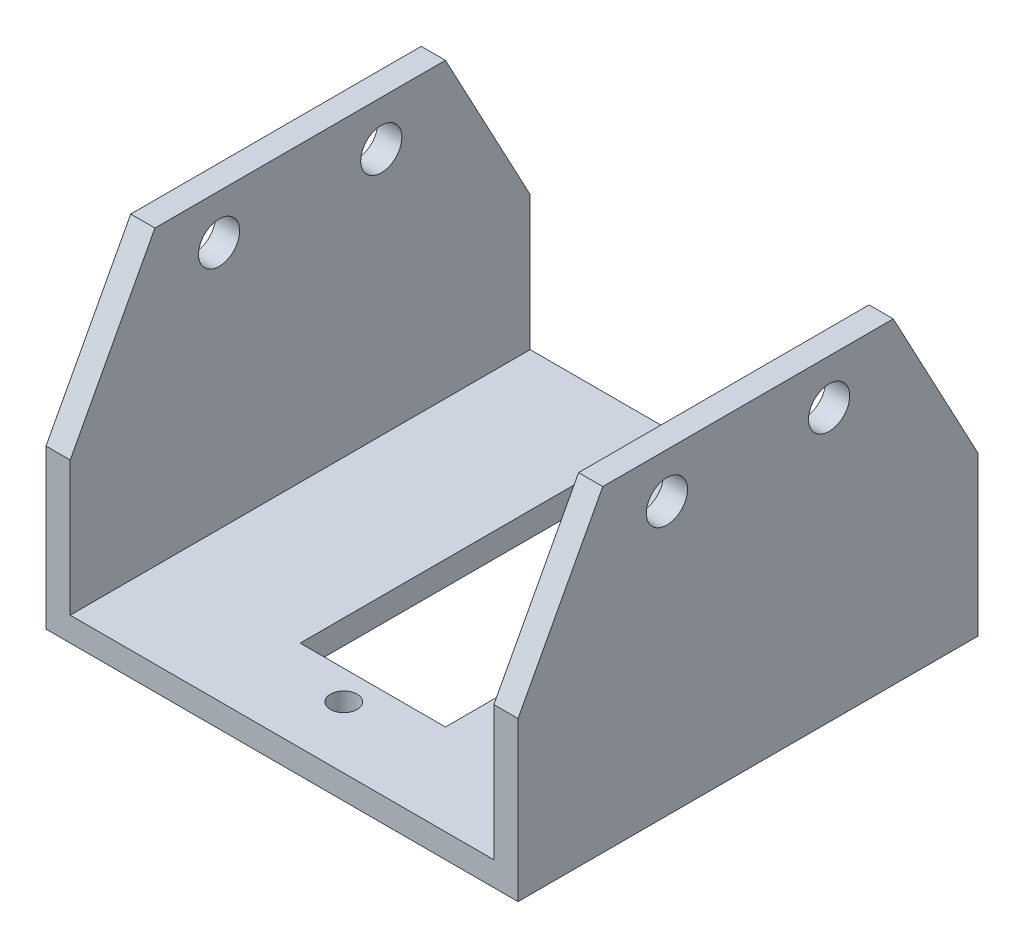
ISO-10303-21;
HEADER;
FILE_DESCRIPTION(('STEP AP214'),'2;1');
FILE_NAME('part.step','',(''),(''),'','','');
FILE_SCHEMA(('AUTOMOTIVE_DESIGN { 1 0 10303 214 1 1 1 1 }'));
ENDSEC;
DATA;
#1=APPLICATION_CONTEXT('core data for automotive mechanical design processes');
#2=APPLICATION_PROTOCOL_DEFINITION('international standard','automotive_design',2000,#1);
#3=PRODUCT_CONTEXT('',#1,'mechanical');
#4=PRODUCT('Part','Part','',(#3));
#5=PRODUCT_RELATED_PRODUCT_CATEGORY('part','',(#4));
#6=PRODUCT_DEFINITION_FORMATION('','',#4);
#7=PRODUCT_DEFINITION_CONTEXT('part definition',#1,'design');
#8=PRODUCT_DEFINITION('design','',#6,#7);
#9=PRODUCT_DEFINITION_SHAPE('','',#8);
#10=(LENGTH_UNIT() NAMED_UNIT(*) SI_UNIT(.MILLI.,.METRE.));
#11=(NAMED_UNIT(*) PLANE_ANGLE_UNIT() SI_UNIT($,.RADIAN.));
#12=(NAMED_UNIT(*) SI_UNIT($,.STERADIAN.) SOLID_ANGLE_UNIT());
#13=UNCERTAINTY_MEASURE_WITH_UNIT(LENGTH_MEASURE(1.E-05),#10,'distance_accuracy_value','');
#14=(GEOMETRIC_REPRESENTATION_CONTEXT(3) GLOBAL_UNCERTAINTY_ASSIGNED_CONTEXT((#13)) GLOBAL_UNIT_ASSIGNED_CONTEXT((#10,
#11,#12)) REPRESENTATION_CONTEXT('',''));
#15=CARTESIAN_POINT('',(0.,0.,0.));
#16=DIRECTION('',(0.,0.,1.));
#17=DIRECTION('',(1.,0.,0.));
#18=AXIS2_PLACEMENT_3D('',#15,#16,#17);
#19=CARTESIAN_POINT('',(0.,2.,0.));
#20=DIRECTION('',(0.,-1.,0.));
#21=DIRECTION('',(0.,0.,-1.));
#22=AXIS2_PLACEMENT_3D('',#19,#20,#21);
#23=PLANE('',#22);
#24=DIRECTION('',(1.,0.,0.));
#25=VECTOR('',#24,1.);
#26=CARTESIAN_POINT('',(-27.7267743804398,2.,35.1008543452405));
#27=LINE('',#26,#25);
#28=CARTESIAN_POINT('',(-27.7267743804398,2.,35.1008543452405));
#29=VERTEX_POINT('',#28);
#30=CARTESIAN_POINT('',(-15.7267743804398,2.,35.1008543452405));
#31=VERTEX_POINT('',#30);
#32=EDGE_CURVE('E275',#29,#31,#27,.T.);
#33=ORIENTED_EDGE('',*,*,#32,.F.);
#34=DIRECTION('',(0.,0.,1.));
#35=VECTOR('',#34,1.);
#36=CARTESIAN_POINT('',(-27.7267743804398,2.,35.1008543452405));
#37=LINE('',#36,#35);
#38=CARTESIAN_POINT('',(-27.7267743804398,2.,12.1008543452405));
#39=VERTEX_POINT('',#38);
#40=EDGE_CURVE('E286',#39,#29,#37,.T.);
#41=ORIENTED_EDGE('',*,*,#40,.F.);
#42=DIRECTION('',(-1.,0.,0.));
#43=VECTOR('',#42,1.);
#44=CARTESIAN_POINT('',(-27.7267743804398,2.,12.1008543452405));
#45=LINE('',#44,#43);
#46=CARTESIAN_POINT('',(-15.7267743804398,2.,12.1008543452405));
#47=VERTEX_POINT('',#46);
#48=EDGE_CURVE('E282',#47,#39,#45,.T.);
#49=ORIENTED_EDGE('',*,*,#48,.F.);
#50=DIRECTION('',(0.,0.,-1.));
#51=VECTOR('',#50,1.);
#52=CARTESIAN_POINT('',(-15.7267743804398,2.,35.1008543452405));
#53=LINE('',#52,#51);
#54=EDGE_CURVE('E278',#31,#47,#53,.T.);
#55=ORIENTED_EDGE('',*,*,#54,.F.);
#56=EDGE_LOOP('',(#33,#41,#49,#55));
#57=FACE_BOUND('',#56,.T.);
#58=CARTESIAN_POINT('',(-21.7267743804398,2.,9.70085434524053));
#59=DIRECTION('',(0.,1.,0.));
#60=DIRECTION('',(0.,0.,1.));
#61=AXIS2_PLACEMENT_3D('',#58,#59,#60);
#62=CIRCLE('',#61,1.1);
#63=CARTESIAN_POINT('',(-21.7267743804398,2.,10.8008543452405));
#64=VERTEX_POINT('',#63);
#65=EDGE_CURVE('E267',#64,#64,#62,.T.);
#66=ORIENTED_EDGE('',*,*,#65,.F.);
#67=EDGE_LOOP('',(#66));
#68=FACE_BOUND('',#67,.T.);
#69=CARTESIAN_POINT('',(-21.7267743804398,2.,37.5008543452405));
#70=DIRECTION('',(0.,1.,0.));
#71=DIRECTION('',(0.,0.,-1.));
#72=AXIS2_PLACEMENT_3D('',#69,#70,#71);
#73=CIRCLE('',#72,1.1);
#74=CARTESIAN_POINT('',(-21.7267743804398,2.,36.4008543452405));
#75=VERTEX_POINT('',#74);
#76=EDGE_CURVE('E259',#75,#75,#73,.T.);
#77=ORIENTED_EDGE('',*,*,#76,.F.);
#78=EDGE_LOOP('',(#77));
#79=FACE_BOUND('',#78,.T.);
#80=DIRECTION('',(0.,0.,1.));
#81=VECTOR('',#80,1.);
#82=CARTESIAN_POINT('',(-4.22677438043981,2.,42.6008543452405));
#83=LINE('',#82,#81);
#84=CARTESIAN_POINT('',(-4.2267743804398,2.,4.60085434524053));
#85=VERTEX_POINT('',#84);
#86=CARTESIAN_POINT('',(-4.22677438043981,2.,42.6008543452405));
#87=VERTEX_POINT('',#86);
#88=EDGE_CURVE('E225',#85,#87,#83,.T.);
#89=ORIENTED_EDGE('',*,*,#88,.F.);
#90=DIRECTION('',(-1.,0.,0.));
#91=VECTOR('',#90,1.);
#92=CARTESIAN_POINT('',(-4.22677438043977,2.,4.60085434524053));
#93=LINE('',#92,#91);
#94=CARTESIAN_POINT('',(-39.2267743804398,2.,4.60085434524053));
#95=VERTEX_POINT('',#94);
#96=EDGE_CURVE('E318',#85,#95,#93,.T.);
#97=ORIENTED_EDGE('',*,*,#96,.T.);
#98=DIRECTION('',(0.,0.,-1.));
#99=VECTOR('',#98,1.);
#100=CARTESIAN_POINT('',(-39.2267743804398,2.,4.60085434524053));
#101=LINE('',#100,#99);
#102=CARTESIAN_POINT('',(-39.2267743804398,2.,42.6008543452405));
#103=VERTEX_POINT('',#102);
#104=EDGE_CURVE('E242',#103,#95,#101,.T.);
#105=ORIENTED_EDGE('',*,*,#104,.F.);
#106=DIRECTION('',(1.,0.,0.));
#107=VECTOR('',#106,1.);
#108=CARTESIAN_POINT('',(-41.2267743804398,2.,42.6008543452405));
#109=LINE('',#108,#107);
#110=EDGE_CURVE('E322',#103,#87,#109,.T.);
#111=ORIENTED_EDGE('',*,*,#110,.T.);
#112=EDGE_LOOP('',(#89,#97,#105,#111));
#113=FACE_BOUND('',#112,.T.);
#114=ADVANCED_FACE('F42',(#57,#68,#79,#113),#23,.F.);
#115=CARTESIAN_POINT('',(0.,0.,0.));
#116=DIRECTION('',(0.,-1.,0.));
#117=DIRECTION('',(0.,0.,-1.));
#118=AXIS2_PLACEMENT_3D('',#115,#116,#117);
#119=PLANE('',#118);
#120=CARTESIAN_POINT('',(-21.7267743804398,0.,9.70085434524053));
#121=DIRECTION('',(0.,1.,0.));
#122=DIRECTION('',(0.,0.,1.));
#123=AXIS2_PLACEMENT_3D('',#120,#121,#122);
#124=CIRCLE('',#123,1.1);
#125=CARTESIAN_POINT('',(-21.7267743804398,0.,10.8008543452405));
#126=VERTEX_POINT('',#125);
#127=EDGE_CURVE('E263',#126,#126,#124,.T.);
#128=ORIENTED_EDGE('',*,*,#127,.T.);
#129=EDGE_LOOP('',(#128));
#130=FACE_BOUND('',#129,.T.);
#131=DIRECTION('',(-1.,0.,0.));
#132=VECTOR('',#131,1.);
#133=CARTESIAN_POINT('',(-39.2267743804398,0.,4.60085434524053));
#134=LINE('',#133,#132);
#135=CARTESIAN_POINT('',(-2.22677438043981,0.,4.60085434524053));
#136=VERTEX_POINT('',#135);
#137=CARTESIAN_POINT('',(-41.2267743804398,0.,4.60085434524053));
#138=VERTEX_POINT('',#137);
#139=EDGE_CURVE('E317',#136,#138,#134,.T.);
#140=ORIENTED_EDGE('',*,*,#139,.F.);
#141=DIRECTION('',(0.,0.,-1.));
#142=VECTOR('',#141,1.);
#143=CARTESIAN_POINT('',(-2.22677438043981,0.,4.60085434524053));
#144=LINE('',#143,#142);
#145=CARTESIAN_POINT('',(-2.2267743804398,0.,42.6008543452405));
#146=VERTEX_POINT('',#145);
#147=EDGE_CURVE('E323',#146,#136,#144,.T.);
#148=ORIENTED_EDGE('',*,*,#147,.F.);
#149=DIRECTION('',(1.,0.,0.));
#150=VECTOR('',#149,1.);
#151=CARTESIAN_POINT('',(-4.22677438043979,0.,42.6008543452405));
#152=LINE('',#151,#150);
#153=CARTESIAN_POINT('',(-41.2267743804398,0.,42.6008543452405));
#154=VERTEX_POINT('',#153);
#155=EDGE_CURVE('E332',#154,#146,#152,.T.);
#156=ORIENTED_EDGE('',*,*,#155,.F.);
#157=DIRECTION('',(0.,0.,1.));
#158=VECTOR('',#157,1.);
#159=CARTESIAN_POINT('',(-41.2267743804398,0.,4.60085434524053));
#160=LINE('',#159,#158);
#161=EDGE_CURVE('E181',#138,#154,#160,.T.);
#162=ORIENTED_EDGE('',*,*,#161,.F.);
#163=EDGE_LOOP('',(#140,#148,#156,#162));
#164=FACE_BOUND('',#163,.T.);
#165=DIRECTION('',(0.,0.,1.));
#166=VECTOR('',#165,1.);
#167=CARTESIAN_POINT('',(-27.7267743804398,0.,35.1008543452405));
#168=LINE('',#167,#166);
#169=CARTESIAN_POINT('',(-27.7267743804398,0.,12.1008543452405));
#170=VERTEX_POINT('',#169);
#171=CARTESIAN_POINT('',(-27.7267743804398,0.,35.1008543452405));
#172=VERTEX_POINT('',#171);
#173=EDGE_CURVE('E279',#170,#172,#168,.T.);
#174=ORIENTED_EDGE('',*,*,#173,.T.);
#175=DIRECTION('',(1.,0.,0.));
#176=VECTOR('',#175,1.);
#177=CARTESIAN_POINT('',(-27.7267743804398,0.,35.1008543452405));
#178=LINE('',#177,#176);
#179=CARTESIAN_POINT('',(-15.7267743804398,0.,35.1008543452405));
#180=VERTEX_POINT('',#179);
#181=EDGE_CURVE('E271',#172,#180,#178,.T.);
#182=ORIENTED_EDGE('',*,*,#181,.T.);
#183=DIRECTION('',(0.,0.,-1.));
#184=VECTOR('',#183,1.);
#185=CARTESIAN_POINT('',(-15.7267743804398,0.,35.1008543452405));
#186=LINE('',#185,#184);
#187=CARTESIAN_POINT('',(-15.7267743804398,0.,12.1008543452405));
#188=VERTEX_POINT('',#187);
#189=EDGE_CURVE('E293',#180,#188,#186,.T.);
#190=ORIENTED_EDGE('',*,*,#189,.T.);
#191=DIRECTION('',(-1.,0.,0.));
#192=VECTOR('',#191,1.);
#193=CARTESIAN_POINT('',(-27.7267743804398,0.,12.1008543452405));
#194=LINE('',#193,#192);
#195=EDGE_CURVE('E297',#188,#170,#194,.T.);
#196=ORIENTED_EDGE('',*,*,#195,.T.);
#197=EDGE_LOOP('',(#174,#182,#190,#196));
#198=FACE_BOUND('',#197,.T.);
#199=CARTESIAN_POINT('',(-21.7267743804398,0.,37.5008543452405));
#200=DIRECTION('',(0.,1.,0.));
#201=DIRECTION('',(0.,0.,-1.));
#202=AXIS2_PLACEMENT_3D('',#199,#200,#201);
#203=CIRCLE('',#202,1.1);
#204=CARTESIAN_POINT('',(-21.7267743804398,0.,36.4008543452405));
#205=VERTEX_POINT('',#204);
#206=EDGE_CURVE('E258',#205,#205,#203,.T.);
#207=ORIENTED_EDGE('',*,*,#206,.T.);
#208=EDGE_LOOP('',(#207));
#209=FACE_BOUND('',#208,.T.);
#210=ADVANCED_FACE('F347',(#130,#164,#198,#209),#119,.T.);
#211=CARTESIAN_POINT('',(-39.2267743804398,2.,4.60085434524053));
#212=DIRECTION('',(0.,0.,1.));
#213=DIRECTION('',(1.,0.,0.));
#214=AXIS2_PLACEMENT_3D('',#211,#212,#213);
#215=PLANE('',#214);
#216=DIRECTION('',(0.,-1.,0.));
#217=VECTOR('',#216,1.);
#218=CARTESIAN_POINT('',(-41.2267743804398,2.,4.60085434524053));
#219=LINE('',#218,#217);
#220=CARTESIAN_POINT('',(-41.2267743804398,13.1,4.60085434524053));
#221=VERTEX_POINT('',#220);
#222=EDGE_CURVE('E183',#221,#138,#219,.T.);
#223=ORIENTED_EDGE('',*,*,#222,.F.);
#224=DIRECTION('',(1.,0.,0.));
#225=VECTOR('',#224,1.);
#226=CARTESIAN_POINT('',(-41.2267743804398,13.1,4.60085434524053));
#227=LINE('',#226,#225);
#228=CARTESIAN_POINT('',(-39.2267743804398,13.1,4.60085434524053));
#229=VERTEX_POINT('',#228);
#230=EDGE_CURVE('E360',#221,#229,#227,.T.);
#231=ORIENTED_EDGE('',*,*,#230,.T.);
#232=DIRECTION('',(0.,-1.,0.));
#233=VECTOR('',#232,1.);
#234=CARTESIAN_POINT('',(-39.2267743804398,26.2,4.60085434524053));
#235=LINE('',#234,#233);
#236=EDGE_CURVE('E250',#229,#95,#235,.T.);
#237=ORIENTED_EDGE('',*,*,#236,.T.);
#238=ORIENTED_EDGE('',*,*,#96,.F.);
#239=DIRECTION('',(0.,-1.,0.));
#240=VECTOR('',#239,1.);
#241=CARTESIAN_POINT('',(-4.22677438043981,26.2,4.60085434524053));
#242=LINE('',#241,#240);
#243=CARTESIAN_POINT('',(-4.22677438043981,13.1,4.60085434524053));
#244=VERTEX_POINT('',#243);
#245=EDGE_CURVE('E239',#244,#85,#242,.T.);
#246=ORIENTED_EDGE('',*,*,#245,.F.);
#247=CARTESIAN_POINT('',(-2.22677438043981,13.1,4.60085434524053));
#248=VERTEX_POINT('',#247);
#249=EDGE_CURVE('E343',#244,#248,#227,.T.);
#250=ORIENTED_EDGE('',*,*,#249,.T.);
#251=DIRECTION('',(0.,-1.,0.));
#252=VECTOR('',#251,1.);
#253=CARTESIAN_POINT('',(-2.22677438043981,2.,4.60085434524053));
#254=LINE('',#253,#252);
#255=EDGE_CURVE('E189',#248,#136,#254,.T.);
#256=ORIENTED_EDGE('',*,*,#255,.T.);
#257=ORIENTED_EDGE('',*,*,#139,.T.);
#258=EDGE_LOOP('',(#223,#231,#237,#238,#246,#250,#256,#257));
#259=FACE_BOUND('',#258,.T.);
#260=ADVANCED_FACE('F44',(#259),#215,.F.);
#261=CARTESIAN_POINT('',(-41.2267743804398,2.,4.60085434524053));
#262=DIRECTION('',(1.,0.,0.));
#263=DIRECTION('',(0.,0.,-1.));
#264=AXIS2_PLACEMENT_3D('',#261,#262,#263);
#265=PLANE('',#264);
#266=CARTESIAN_POINT('',(-41.2267743804398,22.5,30.3008543452405));
#267=DIRECTION('',(1.,0.,0.));
#268=DIRECTION('',(0.,0.,-1.));
#269=AXIS2_PLACEMENT_3D('',#266,#267,#268);
#270=CIRCLE('',#269,1.7);
#271=CARTESIAN_POINT('',(-41.2267743804398,22.5,28.6008543452405));
#272=VERTEX_POINT('',#271);
#273=EDGE_CURVE('E232',#272,#272,#270,.T.);
#274=ORIENTED_EDGE('',*,*,#273,.T.);
#275=EDGE_LOOP('',(#274));
#276=FACE_BOUND('',#275,.T.);
#277=CARTESIAN_POINT('',(-41.2267743804398,22.5,16.9008543452405));
#278=DIRECTION('',(1.,0.,0.));
#279=DIRECTION('',(0.,0.,-1.));
#280=AXIS2_PLACEMENT_3D('',#277,#278,#279);
#281=CIRCLE('',#280,1.7);
#282=CARTESIAN_POINT('',(-41.2267743804398,22.5,15.2008543452405));
#283=VERTEX_POINT('',#282);
#284=EDGE_CURVE('E203',#283,#283,#281,.T.);
#285=ORIENTED_EDGE('',*,*,#284,.T.);
#286=EDGE_LOOP('',(#285));
#287=FACE_BOUND('',#286,.T.);
#288=DIRECTION('',(0.,-1.,0.));
#289=VECTOR('',#288,1.);
#290=CARTESIAN_POINT('',(-41.2267743804398,2.,42.6008543452405));
#291=LINE('',#290,#289);
#292=CARTESIAN_POINT('',(-41.2267743804398,13.1,42.6008543452405));
#293=VERTEX_POINT('',#292);
#294=EDGE_CURVE('E172',#293,#154,#291,.T.);
#295=ORIENTED_EDGE('',*,*,#294,.F.);
#296=DIRECTION('',(0.,0.881979921347387,-0.47128698087265));
#297=VECTOR('',#296,1.);
#298=CARTESIAN_POINT('',(-41.2267743804398,26.2,35.6008543452405));
#299=LINE('',#298,#297);
#300=CARTESIAN_POINT('',(-41.2267743804398,26.2,35.6008543452405));
#301=VERTEX_POINT('',#300);
#302=EDGE_CURVE('E154',#293,#301,#299,.T.);
#303=ORIENTED_EDGE('',*,*,#302,.T.);
#304=DIRECTION('',(0.,0.,1.));
#305=VECTOR('',#304,1.);
#306=CARTESIAN_POINT('',(-41.2267743804398,26.2,42.6008543452405));
#307=LINE('',#306,#305);
#308=CARTESIAN_POINT('',(-41.2267743804398,26.2,11.6008543452405));
#309=VERTEX_POINT('',#308);
#310=EDGE_CURVE('E243',#309,#301,#307,.T.);
#311=ORIENTED_EDGE('',*,*,#310,.F.);
#312=DIRECTION('',(0.,-0.881979921347387,-0.47128698087265));
#313=VECTOR('',#312,1.);
#314=CARTESIAN_POINT('',(-41.2267743804398,26.2,11.6008543452405));
#315=LINE('',#314,#313);
#316=EDGE_CURVE('E66',#309,#221,#315,.T.);
#317=ORIENTED_EDGE('',*,*,#316,.T.);
#318=ORIENTED_EDGE('',*,*,#222,.T.);
#319=ORIENTED_EDGE('',*,*,#161,.T.);
#320=EDGE_LOOP('',(#295,#303,#311,#317,#318,#319));
#321=FACE_BOUND('',#320,.T.);
#322=ADVANCED_FACE('F179',(#276,#287,#321),#265,.F.);
#323=CARTESIAN_POINT('',(-4.22677438043979,2.,42.6008543452405));
#324=DIRECTION('',(0.,0.,-1.));
#325=DIRECTION('',(-1.,0.,0.));
#326=AXIS2_PLACEMENT_3D('',#323,#324,#325);
#327=PLANE('',#326);
#328=DIRECTION('',(0.,-1.,0.));
#329=VECTOR('',#328,1.);
#330=CARTESIAN_POINT('',(-2.2267743804398,2.,42.6008543452405));
#331=LINE('',#330,#329);
#332=CARTESIAN_POINT('',(-2.2267743804398,13.1,42.6008543452405));
#333=VERTEX_POINT('',#332);
#334=EDGE_CURVE('E184',#333,#146,#331,.T.);
#335=ORIENTED_EDGE('',*,*,#334,.F.);
#336=DIRECTION('',(1.,0.,0.));
#337=VECTOR('',#336,1.);
#338=CARTESIAN_POINT('',(-41.2267743804398,13.1,42.6008543452405));
#339=LINE('',#338,#337);
#340=CARTESIAN_POINT('',(-4.22677438043981,13.1,42.6008543452405));
#341=VERTEX_POINT('',#340);
#342=EDGE_CURVE('E164',#341,#333,#339,.T.);
#343=ORIENTED_EDGE('',*,*,#342,.F.);
#344=DIRECTION('',(0.,-1.,0.));
#345=VECTOR('',#344,1.);
#346=CARTESIAN_POINT('',(-4.22677438043981,26.2,42.6008543452405));
#347=LINE('',#346,#345);
#348=EDGE_CURVE('E229',#341,#87,#347,.T.);
#349=ORIENTED_EDGE('',*,*,#348,.T.);
#350=ORIENTED_EDGE('',*,*,#110,.F.);
#351=DIRECTION('',(0.,-1.,0.));
#352=VECTOR('',#351,1.);
#353=CARTESIAN_POINT('',(-39.2267743804398,26.2,42.6008543452405));
#354=LINE('',#353,#352);
#355=CARTESIAN_POINT('',(-39.2267743804398,13.1,42.6008543452405));
#356=VERTEX_POINT('',#355);
#357=EDGE_CURVE('E175',#356,#103,#354,.T.);
#358=ORIENTED_EDGE('',*,*,#357,.F.);
#359=EDGE_CURVE('E157',#293,#356,#339,.T.);
#360=ORIENTED_EDGE('',*,*,#359,.F.);
#361=ORIENTED_EDGE('',*,*,#294,.T.);
#362=ORIENTED_EDGE('',*,*,#155,.T.);
#363=EDGE_LOOP('',(#335,#343,#349,#350,#358,#360,#361,#362));
#364=FACE_BOUND('',#363,.T.);
#365=ADVANCED_FACE('F170',(#364),#327,.F.);
#366=CARTESIAN_POINT('',(-2.22677438043981,2.,4.60085434524053));
#367=DIRECTION('',(-1.,0.,0.));
#368=DIRECTION('',(0.,0.,1.));
#369=AXIS2_PLACEMENT_3D('',#366,#367,#368);
#370=PLANE('',#369);
#371=CARTESIAN_POINT('',(-2.22677438043981,22.5,30.3008543452405));
#372=DIRECTION('',(1.,0.,0.));
#373=DIRECTION('',(0.,0.,-1.));
#374=AXIS2_PLACEMENT_3D('',#371,#372,#373);
#375=CIRCLE('',#374,1.7);
#376=CARTESIAN_POINT('',(-2.22677438043981,22.5,28.6008543452405));
#377=VERTEX_POINT('',#376);
#378=EDGE_CURVE('E198',#377,#377,#375,.T.);
#379=ORIENTED_EDGE('',*,*,#378,.F.);
#380=EDGE_LOOP('',(#379));
#381=FACE_BOUND('',#380,.T.);
#382=CARTESIAN_POINT('',(-2.22677438043981,22.5,16.9008543452405));
#383=DIRECTION('',(1.,0.,0.));
#384=DIRECTION('',(0.,0.,1.));
#385=AXIS2_PLACEMENT_3D('',#382,#383,#384);
#386=CIRCLE('',#385,1.7);
#387=CARTESIAN_POINT('',(-2.22677438043981,22.5,18.6008543452405));
#388=VERTEX_POINT('',#387);
#389=EDGE_CURVE('E367',#388,#388,#386,.T.);
#390=ORIENTED_EDGE('',*,*,#389,.F.);
#391=EDGE_LOOP('',(#390));
#392=FACE_BOUND('',#391,.T.);
#393=DIRECTION('',(0.,0.,-1.));
#394=VECTOR('',#393,1.);
#395=CARTESIAN_POINT('',(-2.22677438043981,26.2,4.60085434524053));
#396=LINE('',#395,#394);
#397=CARTESIAN_POINT('',(-2.2267743804398,26.2,35.6008543452405));
#398=VERTEX_POINT('',#397);
#399=CARTESIAN_POINT('',(-2.2267743804398,26.2,11.6008543452405));
#400=VERTEX_POINT('',#399);
#401=EDGE_CURVE('E213',#398,#400,#396,.T.);
#402=ORIENTED_EDGE('',*,*,#401,.F.);
#403=DIRECTION('',(0.,0.881979921347387,-0.47128698087265));
#404=VECTOR('',#403,1.);
#405=CARTESIAN_POINT('',(-2.2267743804398,26.2,35.6008543452405));
#406=LINE('',#405,#404);
#407=EDGE_CURVE('E165',#333,#398,#406,.T.);
#408=ORIENTED_EDGE('',*,*,#407,.F.);
#409=ORIENTED_EDGE('',*,*,#334,.T.);
#410=ORIENTED_EDGE('',*,*,#147,.T.);
#411=ORIENTED_EDGE('',*,*,#255,.F.);
#412=DIRECTION('',(0.,-0.881979921347387,-0.47128698087265));
#413=VECTOR('',#412,1.);
#414=CARTESIAN_POINT('',(-2.2267743804398,26.2,11.6008543452405));
#415=LINE('',#414,#413);
#416=EDGE_CURVE('E664',#400,#248,#415,.T.);
#417=ORIENTED_EDGE('',*,*,#416,.F.);
#418=EDGE_LOOP('',(#402,#408,#409,#410,#411,#417));
#419=FACE_BOUND('',#418,.T.);
#420=ADVANCED_FACE('F349',(#381,#392,#419),#370,.F.);
#421=CARTESIAN_POINT('',(-27.7267743804398,2.,35.1008543452405));
#422=DIRECTION('',(0.,0.,-1.));
#423=DIRECTION('',(-1.,0.,0.));
#424=AXIS2_PLACEMENT_3D('',#421,#422,#423);
#425=PLANE('',#424);
#426=ORIENTED_EDGE('',*,*,#181,.F.);
#427=DIRECTION('',(0.,-1.,0.));
#428=VECTOR('',#427,1.);
#429=CARTESIAN_POINT('',(-27.7267743804398,2.,35.1008543452405));
#430=LINE('',#429,#428);
#431=EDGE_CURVE('E289',#29,#172,#430,.T.);
#432=ORIENTED_EDGE('',*,*,#431,.F.);
#433=ORIENTED_EDGE('',*,*,#32,.T.);
#434=DIRECTION('',(0.,-1.,0.));
#435=VECTOR('',#434,1.);
#436=CARTESIAN_POINT('',(-15.7267743804398,2.,35.1008543452405));
#437=LINE('',#436,#435);
#438=EDGE_CURVE('E313',#31,#180,#437,.T.);
#439=ORIENTED_EDGE('',*,*,#438,.T.);
#440=EDGE_LOOP('',(#426,#432,#433,#439));
#441=FACE_BOUND('',#440,.T.);
#442=ADVANCED_FACE('F424',(#441),#425,.T.);
#443=CARTESIAN_POINT('',(-15.7267743804398,2.,35.1008543452405));
#444=DIRECTION('',(-1.,0.,0.));
#445=DIRECTION('',(0.,0.,1.));
#446=AXIS2_PLACEMENT_3D('',#443,#444,#445);
#447=PLANE('',#446);
#448=ORIENTED_EDGE('',*,*,#189,.F.);
#449=ORIENTED_EDGE('',*,*,#438,.F.);
#450=ORIENTED_EDGE('',*,*,#54,.T.);
#451=DIRECTION('',(0.,-1.,0.));
#452=VECTOR('',#451,1.);
#453=CARTESIAN_POINT('',(-15.7267743804398,2.,12.1008543452405));
#454=LINE('',#453,#452);
#455=EDGE_CURVE('E310',#47,#188,#454,.T.);
#456=ORIENTED_EDGE('',*,*,#455,.T.);
#457=EDGE_LOOP('',(#448,#449,#450,#456));
#458=FACE_BOUND('',#457,.T.);
#459=ADVANCED_FACE('F517',(#458),#447,.T.);
#460=CARTESIAN_POINT('',(-27.7267743804398,2.,12.1008543452405));
#461=DIRECTION('',(0.,0.,1.));
#462=DIRECTION('',(1.,0.,0.));
#463=AXIS2_PLACEMENT_3D('',#460,#461,#462);
#464=PLANE('',#463);
#465=ORIENTED_EDGE('',*,*,#195,.F.);
#466=ORIENTED_EDGE('',*,*,#455,.F.);
#467=ORIENTED_EDGE('',*,*,#48,.T.);
#468=DIRECTION('',(0.,-1.,0.));
#469=VECTOR('',#468,1.);
#470=CARTESIAN_POINT('',(-27.7267743804398,2.,12.1008543452405));
#471=LINE('',#470,#469);
#472=EDGE_CURVE('E307',#39,#170,#471,.T.);
#473=ORIENTED_EDGE('',*,*,#472,.T.);
#474=EDGE_LOOP('',(#465,#466,#467,#473));
#475=FACE_BOUND('',#474,.T.);
#476=ADVANCED_FACE('F506',(#475),#464,.T.);
#477=CARTESIAN_POINT('',(-27.7267743804398,2.,35.1008543452405));
#478=DIRECTION('',(1.,0.,0.));
#479=DIRECTION('',(0.,0.,-1.));
#480=AXIS2_PLACEMENT_3D('',#477,#478,#479);
#481=PLANE('',#480);
#482=ORIENTED_EDGE('',*,*,#173,.F.);
#483=ORIENTED_EDGE('',*,*,#472,.F.);
#484=ORIENTED_EDGE('',*,*,#40,.T.);
#485=ORIENTED_EDGE('',*,*,#431,.T.);
#486=EDGE_LOOP('',(#482,#483,#484,#485));
#487=FACE_BOUND('',#486,.T.);
#488=ADVANCED_FACE('F495',(#487),#481,.T.);
#489=CARTESIAN_POINT('',(-21.7267743804398,2.,9.70085434524053));
#490=DIRECTION('',(0.,-1.,0.));
#491=DIRECTION('',(0.,0.,-1.));
#492=AXIS2_PLACEMENT_3D('',#489,#490,#491);
#493=CYLINDRICAL_SURFACE('',#492,1.1);
#494=ORIENTED_EDGE('',*,*,#65,.T.);
#495=EDGE_LOOP('',(#494));
#496=FACE_BOUND('',#495,.T.);
#497=ORIENTED_EDGE('',*,*,#127,.F.);
#498=EDGE_LOOP('',(#497));
#499=FACE_BOUND('',#498,.T.);
#500=ADVANCED_FACE('F482',(#496,#499),#493,.F.);
#501=CARTESIAN_POINT('',(-21.7267743804398,2.,37.5008543452405));
#502=DIRECTION('',(0.,-1.,0.));
#503=DIRECTION('',(0.,0.,-1.));
#504=AXIS2_PLACEMENT_3D('',#501,#502,#503);
#505=CYLINDRICAL_SURFACE('',#504,1.1);
#506=ORIENTED_EDGE('',*,*,#76,.T.);
#507=EDGE_LOOP('',(#506));
#508=FACE_BOUND('',#507,.T.);
#509=ORIENTED_EDGE('',*,*,#206,.F.);
#510=EDGE_LOOP('',(#509));
#511=FACE_BOUND('',#510,.T.);
#512=ADVANCED_FACE('F477',(#508,#511),#505,.F.);
#513=CARTESIAN_POINT('',(-39.2267743804398,26.2,4.60085434524053));
#514=DIRECTION('',(-1.,0.,0.));
#515=DIRECTION('',(0.,0.,1.));
#516=AXIS2_PLACEMENT_3D('',#513,#514,#515);
#517=PLANE('',#516);
#518=CARTESIAN_POINT('',(-39.2267743804398,22.5,30.3008543452405));
#519=DIRECTION('',(-1.,0.,0.));
#520=DIRECTION('',(0.,0.,1.));
#521=AXIS2_PLACEMENT_3D('',#518,#519,#520);
#522=CIRCLE('',#521,1.7);
#523=CARTESIAN_POINT('',(-39.2267743804398,22.5,32.0008543452405));
#524=VERTEX_POINT('',#523);
#525=EDGE_CURVE('E202',#524,#524,#522,.T.);
#526=ORIENTED_EDGE('',*,*,#525,.T.);
#527=EDGE_LOOP('',(#526));
#528=FACE_BOUND('',#527,.T.);
#529=CARTESIAN_POINT('',(-39.2267743804398,22.5,16.9008543452405));
#530=DIRECTION('',(-1.,0.,0.));
#531=DIRECTION('',(0.,0.,1.));
#532=AXIS2_PLACEMENT_3D('',#529,#530,#531);
#533=CIRCLE('',#532,1.7);
#534=CARTESIAN_POINT('',(-39.2267743804398,22.5,18.6008543452405));
#535=VERTEX_POINT('',#534);
#536=EDGE_CURVE('E197',#535,#535,#533,.T.);
#537=ORIENTED_EDGE('',*,*,#536,.T.);
#538=EDGE_LOOP('',(#537));
#539=FACE_BOUND('',#538,.T.);
#540=DIRECTION('',(0.,0.,-1.));
#541=VECTOR('',#540,1.);
#542=CARTESIAN_POINT('',(-39.2267743804398,26.2,4.60085434524053));
#543=LINE('',#542,#541);
#544=CARTESIAN_POINT('',(-39.2267743804398,26.2,35.6008543452405));
#545=VERTEX_POINT('',#544);
#546=CARTESIAN_POINT('',(-39.2267743804398,26.2,11.6008543452405));
#547=VERTEX_POINT('',#546);
#548=EDGE_CURVE('E246',#545,#547,#543,.T.);
#549=ORIENTED_EDGE('',*,*,#548,.F.);
#550=DIRECTION('',(0.,-0.881979921347387,0.47128698087265));
#551=VECTOR('',#550,1.);
#552=CARTESIAN_POINT('',(-39.2267743804398,39.0856352839853,28.7154003766988));
#553=LINE('',#552,#551);
#554=EDGE_CURVE('E58',#545,#356,#553,.T.);
#555=ORIENTED_EDGE('',*,*,#554,.T.);
#556=ORIENTED_EDGE('',*,*,#357,.T.);
#557=ORIENTED_EDGE('',*,*,#104,.T.);
#558=ORIENTED_EDGE('',*,*,#236,.F.);
#559=DIRECTION('',(0.,0.881979921347387,0.47128698087265));
#560=VECTOR('',#559,1.);
#561=CARTESIAN_POINT('',(-39.2267743804398,23.2903404197452,10.0460744168601));
#562=LINE('',#561,#560);
#563=EDGE_CURVE('E365',#229,#547,#562,.T.);
#564=ORIENTED_EDGE('',*,*,#563,.T.);
#565=EDGE_LOOP('',(#549,#555,#556,#557,#558,#564));
#566=FACE_BOUND('',#565,.T.);
#567=ADVANCED_FACE('F364',(#528,#539,#566),#517,.F.);
#568=CARTESIAN_POINT('',(0.,26.2,0.));
#569=DIRECTION('',(0.,-1.,0.));
#570=DIRECTION('',(0.,0.,-1.));
#571=AXIS2_PLACEMENT_3D('',#568,#569,#570);
#572=PLANE('',#571);
#573=ORIENTED_EDGE('',*,*,#310,.T.);
#574=DIRECTION('',(1.,0.,0.));
#575=VECTOR('',#574,1.);
#576=CARTESIAN_POINT('',(-41.2267743804398,26.2,35.6008543452405));
#577=LINE('',#576,#575);
#578=EDGE_CURVE('E158',#301,#545,#577,.T.);
#579=ORIENTED_EDGE('',*,*,#578,.T.);
#580=ORIENTED_EDGE('',*,*,#548,.T.);
#581=DIRECTION('',(1.,0.,0.));
#582=VECTOR('',#581,1.);
#583=CARTESIAN_POINT('',(-41.2267743804398,26.2,11.6008543452405));
#584=LINE('',#583,#582);
#585=EDGE_CURVE('E661',#309,#547,#584,.T.);
#586=ORIENTED_EDGE('',*,*,#585,.F.);
#587=EDGE_LOOP('',(#573,#579,#580,#586));
#588=FACE_BOUND('',#587,.T.);
#589=ADVANCED_FACE('F605',(#588),#572,.F.);
#590=CARTESIAN_POINT('',(-4.22677438043981,26.2,42.6008543452405));
#591=DIRECTION('',(1.,0.,0.));
#592=DIRECTION('',(0.,0.,-1.));
#593=AXIS2_PLACEMENT_3D('',#590,#591,#592);
#594=PLANE('',#593);
#595=CARTESIAN_POINT('',(-4.22677438043981,22.5,30.3008543452405));
#596=DIRECTION('',(1.,0.,0.));
#597=DIRECTION('',(0.,0.,-1.));
#598=AXIS2_PLACEMENT_3D('',#595,#596,#597);
#599=CIRCLE('',#598,1.7);
#600=CARTESIAN_POINT('',(-4.22677438043981,22.5,28.6008543452405));
#601=VERTEX_POINT('',#600);
#602=EDGE_CURVE('E199',#601,#601,#599,.T.);
#603=ORIENTED_EDGE('',*,*,#602,.T.);
#604=EDGE_LOOP('',(#603));
#605=FACE_BOUND('',#604,.T.);
#606=CARTESIAN_POINT('',(-4.22677438043981,22.5,16.9008543452405));
#607=DIRECTION('',(1.,0.,0.));
#608=DIRECTION('',(0.,0.,-1.));
#609=AXIS2_PLACEMENT_3D('',#606,#607,#608);
#610=CIRCLE('',#609,1.7);
#611=CARTESIAN_POINT('',(-4.22677438043981,22.5,15.2008543452405));
#612=VERTEX_POINT('',#611);
#613=EDGE_CURVE('E193',#612,#612,#610,.T.);
#614=ORIENTED_EDGE('',*,*,#613,.T.);
#615=EDGE_LOOP('',(#614));
#616=FACE_BOUND('',#615,.T.);
#617=ORIENTED_EDGE('',*,*,#348,.F.);
#618=DIRECTION('',(0.,0.881979921347387,-0.47128698087265));
#619=VECTOR('',#618,1.);
#620=CARTESIAN_POINT('',(-4.22677438043981,23.2903404197453,37.1556342736209));
#621=LINE('',#620,#619);
#622=CARTESIAN_POINT('',(-4.22677438043981,26.2,35.6008543452405));
#623=VERTEX_POINT('',#622);
#624=EDGE_CURVE('E223',#341,#623,#621,.T.);
#625=ORIENTED_EDGE('',*,*,#624,.T.);
#626=DIRECTION('',(0.,0.,1.));
#627=VECTOR('',#626,1.);
#628=CARTESIAN_POINT('',(-4.22677438043981,26.2,42.6008543452405));
#629=LINE('',#628,#627);
#630=CARTESIAN_POINT('',(-4.22677438043981,26.2,11.6008543452405));
#631=VERTEX_POINT('',#630);
#632=EDGE_CURVE('E211',#631,#623,#629,.T.);
#633=ORIENTED_EDGE('',*,*,#632,.F.);
#634=DIRECTION('',(0.,-0.881979921347387,-0.47128698087265));
#635=VECTOR('',#634,1.);
#636=CARTESIAN_POINT('',(-4.22677438043981,39.0856352839853,18.4863083137823));
#637=LINE('',#636,#635);
#638=EDGE_CURVE('E221',#631,#244,#637,.T.);
#639=ORIENTED_EDGE('',*,*,#638,.T.);
#640=ORIENTED_EDGE('',*,*,#245,.T.);
#641=ORIENTED_EDGE('',*,*,#88,.T.);
#642=EDGE_LOOP('',(#617,#625,#633,#639,#640,#641));
#643=FACE_BOUND('',#642,.T.);
#644=ADVANCED_FACE('F220',(#605,#616,#643),#594,.F.);
#645=CARTESIAN_POINT('',(0.,26.2,0.));
#646=DIRECTION('',(0.,-1.,0.));
#647=DIRECTION('',(0.,0.,-1.));
#648=AXIS2_PLACEMENT_3D('',#645,#646,#647);
#649=PLANE('',#648);
#650=ORIENTED_EDGE('',*,*,#632,.T.);
#651=DIRECTION('',(1.,0.,0.));
#652=VECTOR('',#651,1.);
#653=CARTESIAN_POINT('',(0.,26.2,35.6008543452405));
#654=LINE('',#653,#652);
#655=EDGE_CURVE('E11',#623,#398,#654,.T.);
#656=ORIENTED_EDGE('',*,*,#655,.T.);
#657=ORIENTED_EDGE('',*,*,#401,.T.);
#658=DIRECTION('',(-1.,0.,0.));
#659=VECTOR('',#658,1.);
#660=CARTESIAN_POINT('',(0.,26.2,11.6008543452405));
#661=LINE('',#660,#659);
#662=EDGE_CURVE('E51',#400,#631,#661,.T.);
#663=ORIENTED_EDGE('',*,*,#662,.T.);
#664=EDGE_LOOP('',(#650,#656,#657,#663));
#665=FACE_BOUND('',#664,.T.);
#666=ADVANCED_FACE('F210',(#665),#649,.F.);
#667=CARTESIAN_POINT('',(-52.2267743804398,22.5,16.9008543452405));
#668=DIRECTION('',(1.,0.,0.));
#669=DIRECTION('',(0.,0.,-1.));
#670=AXIS2_PLACEMENT_3D('',#667,#668,#669);
#671=CYLINDRICAL_SURFACE('',#670,1.7);
#672=ORIENTED_EDGE('',*,*,#389,.T.);
#673=EDGE_LOOP('',(#672));
#674=FACE_BOUND('',#673,.T.);
#675=ORIENTED_EDGE('',*,*,#613,.F.);
#676=EDGE_LOOP('',(#675));
#677=FACE_BOUND('',#676,.T.);
#678=ADVANCED_FACE('F410',(#674,#677),#671,.F.);
#679=CARTESIAN_POINT('',(-52.2267743804398,22.5,30.3008543452405));
#680=DIRECTION('',(1.,0.,0.));
#681=DIRECTION('',(0.,0.,-1.));
#682=AXIS2_PLACEMENT_3D('',#679,#680,#681);
#683=CYLINDRICAL_SURFACE('',#682,1.7);
#684=ORIENTED_EDGE('',*,*,#378,.T.);
#685=EDGE_LOOP('',(#684));
#686=FACE_BOUND('',#685,.T.);
#687=ORIENTED_EDGE('',*,*,#602,.F.);
#688=EDGE_LOOP('',(#687));
#689=FACE_BOUND('',#688,.T.);
#690=ADVANCED_FACE('F400',(#686,#689),#683,.F.);
#691=ORIENTED_EDGE('',*,*,#536,.F.);
#692=EDGE_LOOP('',(#691));
#693=FACE_BOUND('',#692,.T.);
#694=ORIENTED_EDGE('',*,*,#284,.F.);
#695=EDGE_LOOP('',(#694));
#696=FACE_BOUND('',#695,.T.);
#697=ADVANCED_FACE('F397',(#693,#696),#671,.F.);
#698=ORIENTED_EDGE('',*,*,#525,.F.);
#699=EDGE_LOOP('',(#698));
#700=FACE_BOUND('',#699,.T.);
#701=ORIENTED_EDGE('',*,*,#273,.F.);
#702=EDGE_LOOP('',(#701));
#703=FACE_BOUND('',#702,.T.);
#704=ADVANCED_FACE('F394',(#700,#703),#683,.F.);
#705=CARTESIAN_POINT('',(-41.2267743804398,26.2,11.6008543452405));
#706=DIRECTION('',(0.,-0.47128698087265,0.881979921347387));
#707=DIRECTION('',(0.,-0.881979921347387,-0.47128698087265));
#708=AXIS2_PLACEMENT_3D('',#705,#706,#707);
#709=PLANE('',#708);
#710=ORIENTED_EDGE('',*,*,#662,.F.);
#711=ORIENTED_EDGE('',*,*,#416,.T.);
#712=ORIENTED_EDGE('',*,*,#249,.F.);
#713=ORIENTED_EDGE('',*,*,#638,.F.);
#714=EDGE_LOOP('',(#710,#711,#712,#713));
#715=FACE_BOUND('',#714,.T.);
#716=ADVANCED_FACE('F396',(#715),#709,.F.);
#717=CARTESIAN_POINT('',(-41.2267743804398,26.2,35.6008543452405));
#718=DIRECTION('',(0.,-0.47128698087265,-0.881979921347387));
#719=DIRECTION('',(0.,0.881979921347387,-0.47128698087265));
#720=AXIS2_PLACEMENT_3D('',#717,#718,#719);
#721=PLANE('',#720);
#722=ORIENTED_EDGE('',*,*,#342,.T.);
#723=ORIENTED_EDGE('',*,*,#407,.T.);
#724=ORIENTED_EDGE('',*,*,#655,.F.);
#725=ORIENTED_EDGE('',*,*,#624,.F.);
#726=EDGE_LOOP('',(#722,#723,#724,#725));
#727=FACE_BOUND('',#726,.T.);
#728=ADVANCED_FACE('F405',(#727),#721,.F.);
#729=ORIENTED_EDGE('',*,*,#230,.F.);
#730=ORIENTED_EDGE('',*,*,#316,.F.);
#731=ORIENTED_EDGE('',*,*,#585,.T.);
#732=ORIENTED_EDGE('',*,*,#563,.F.);
#733=EDGE_LOOP('',(#729,#730,#731,#732));
#734=FACE_BOUND('',#733,.T.);
#735=ADVANCED_FACE('F407',(#734),#709,.F.);
#736=ORIENTED_EDGE('',*,*,#578,.F.);
#737=ORIENTED_EDGE('',*,*,#302,.F.);
#738=ORIENTED_EDGE('',*,*,#359,.T.);
#739=ORIENTED_EDGE('',*,*,#554,.F.);
#740=EDGE_LOOP('',(#736,#737,#738,#739));
#741=FACE_BOUND('',#740,.T.);
#742=ADVANCED_FACE('F156',(#741),#721,.F.);
#743=CLOSED_SHELL('',(#114,#210,#260,#322,#365,#420,#442,#459,#476,#488,#500,#512,#567,#589,
#644,#666,#678,#690,#697,#704,#716,#728,#735,#742));
#744=MANIFOLD_SOLID_BREP('B2',#743);
#745=ADVANCED_BREP_SHAPE_REPRESENTATION('',(#18,#744),#14);
#746=SHAPE_DEFINITION_REPRESENTATION(#9,#745);
ENDSEC;
END-ISO-10303-21;
